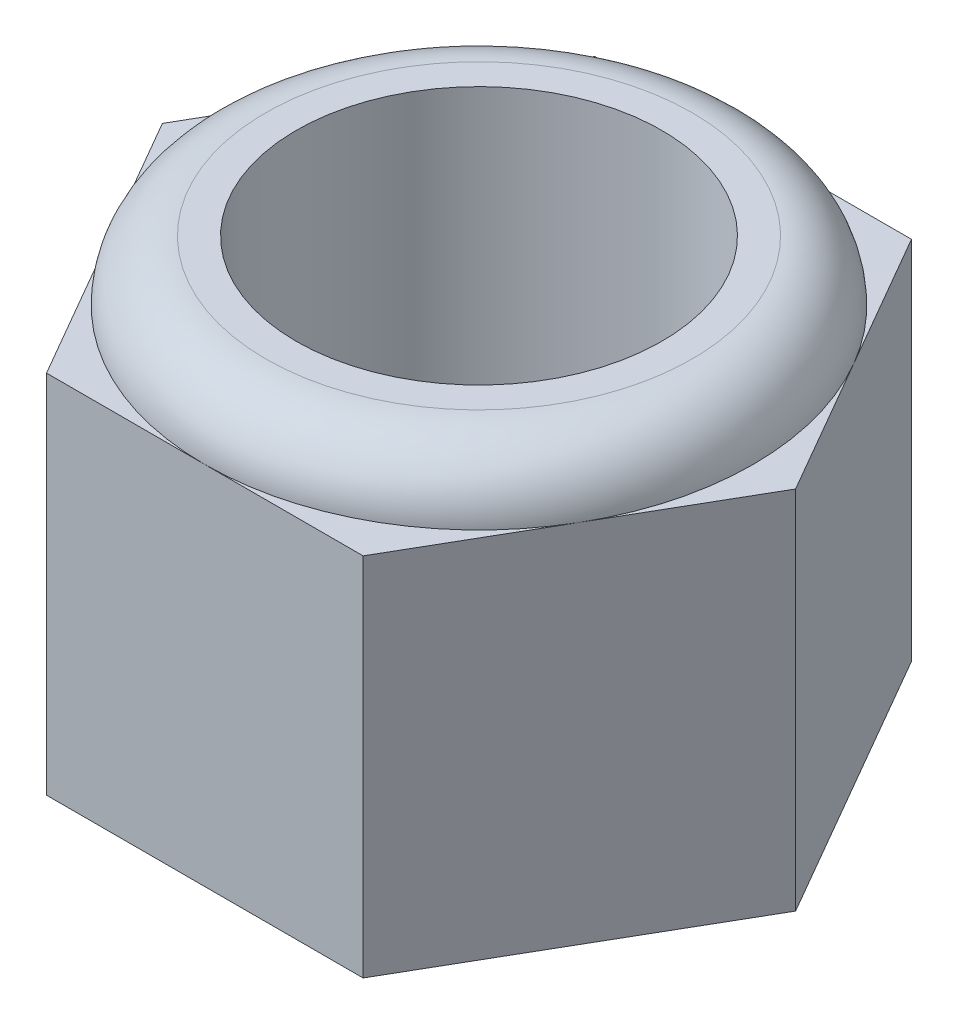
ISO-10303-21;
HEADER;
FILE_DESCRIPTION(('STEP AP214'),'2;1');
FILE_NAME('part.step','',(''),(''),'','','');
FILE_SCHEMA(('AUTOMOTIVE_DESIGN { 1 0 10303 214 1 1 1 1 }'));
ENDSEC;
DATA;
#1=APPLICATION_CONTEXT('core data for automotive mechanical design processes');
#2=APPLICATION_PROTOCOL_DEFINITION('international standard','automotive_design',2000,#1);
#3=PRODUCT_CONTEXT('',#1,'mechanical');
#4=PRODUCT('Part','Part','',(#3));
#5=PRODUCT_RELATED_PRODUCT_CATEGORY('part','',(#4));
#6=PRODUCT_DEFINITION_FORMATION('','',#4);
#7=PRODUCT_DEFINITION_CONTEXT('part definition',#1,'design');
#8=PRODUCT_DEFINITION('design','',#6,#7);
#9=PRODUCT_DEFINITION_SHAPE('','',#8);
#10=(LENGTH_UNIT() NAMED_UNIT(*) SI_UNIT(.MILLI.,.METRE.));
#11=(NAMED_UNIT(*) PLANE_ANGLE_UNIT() SI_UNIT($,.RADIAN.));
#12=(NAMED_UNIT(*) SI_UNIT($,.STERADIAN.) SOLID_ANGLE_UNIT());
#13=UNCERTAINTY_MEASURE_WITH_UNIT(LENGTH_MEASURE(1.E-05),#10,'distance_accuracy_value','');
#14=(GEOMETRIC_REPRESENTATION_CONTEXT(3) GLOBAL_UNCERTAINTY_ASSIGNED_CONTEXT((#13)) GLOBAL_UNIT_ASSIGNED_CONTEXT((#10,
#11,#12)) REPRESENTATION_CONTEXT('',''));
#15=CARTESIAN_POINT('',(0.,0.,0.));
#16=DIRECTION('',(0.,0.,1.));
#17=DIRECTION('',(1.,0.,0.));
#18=AXIS2_PLACEMENT_3D('',#15,#16,#17);
#19=CARTESIAN_POINT('',(16.4977839420936,22.225,0.));
#20=DIRECTION('',(-0.866025403784438,0.,0.5));
#21=DIRECTION('',(0.5,0.,0.866025403784439));
#22=AXIS2_PLACEMENT_3D('',#19,#20,#21);
#23=PLANE('',#22);
#24=DIRECTION('',(-0.5,0.,-0.866025403784439));
#25=VECTOR('',#24,1.);
#26=CARTESIAN_POINT('',(16.4977839420936,19.05,0.));
#27=LINE('',#26,#25);
#28=CARTESIAN_POINT('',(16.4977839420936,19.05,0.));
#29=VERTEX_POINT('',#28);
#30=CARTESIAN_POINT('',(12.3733379565702,19.05,-7.14375000000001));
#31=VERTEX_POINT('',#30);
#32=EDGE_CURVE('E144',#29,#31,#27,.T.);
#33=ORIENTED_EDGE('',*,*,#32,.F.);
#34=DIRECTION('',(0.,-1.,0.));
#35=VECTOR('',#34,1.);
#36=CARTESIAN_POINT('',(16.4977839420936,22.225,0.));
#37=LINE('',#36,#35);
#38=CARTESIAN_POINT('',(16.4977839420936,0.,0.));
#39=VERTEX_POINT('',#38);
#40=EDGE_CURVE('E60',#29,#39,#37,.T.);
#41=ORIENTED_EDGE('',*,*,#40,.T.);
#42=DIRECTION('',(-0.5,0.,-0.866025403784438));
#43=VECTOR('',#42,1.);
#44=CARTESIAN_POINT('',(16.4977839420936,0.,0.));
#45=LINE('',#44,#43);
#46=CARTESIAN_POINT('',(8.24889197104678,0.,-14.2875));
#47=VERTEX_POINT('',#46);
#48=EDGE_CURVE('E148',#39,#47,#45,.T.);
#49=ORIENTED_EDGE('',*,*,#48,.T.);
#50=DIRECTION('',(0.,-1.,0.));
#51=VECTOR('',#50,1.);
#52=CARTESIAN_POINT('',(8.24889197104678,22.225,-14.2875));
#53=LINE('',#52,#51);
#54=CARTESIAN_POINT('',(8.24889197104678,19.05,-14.2875));
#55=VERTEX_POINT('',#54);
#56=EDGE_CURVE('E173',#55,#47,#53,.T.);
#57=ORIENTED_EDGE('',*,*,#56,.F.);
#58=EDGE_CURVE('E116',#31,#55,#27,.T.);
#59=ORIENTED_EDGE('',*,*,#58,.F.);
#60=EDGE_LOOP('',(#33,#41,#49,#57,#59));
#61=FACE_BOUND('',#60,.T.);
#62=ADVANCED_FACE('F38',(#61),#23,.F.);
#63=CARTESIAN_POINT('',(8.24889197104678,22.225,-14.2875));
#64=DIRECTION('',(0.,0.,1.));
#65=DIRECTION('',(1.,0.,0.));
#66=AXIS2_PLACEMENT_3D('',#63,#64,#65);
#67=PLANE('',#66);
#68=DIRECTION('',(-1.,0.,0.));
#69=VECTOR('',#68,1.);
#70=CARTESIAN_POINT('',(8.24889197104678,19.05,-14.2875));
#71=LINE('',#70,#69);
#72=CARTESIAN_POINT('',(0.,19.05,-14.2875));
#73=VERTEX_POINT('',#72);
#74=EDGE_CURVE('E110',#55,#73,#71,.T.);
#75=ORIENTED_EDGE('',*,*,#74,.F.);
#76=ORIENTED_EDGE('',*,*,#56,.T.);
#77=DIRECTION('',(-1.,0.,0.));
#78=VECTOR('',#77,1.);
#79=CARTESIAN_POINT('',(8.24889197104678,0.,-14.2875));
#80=LINE('',#79,#78);
#81=CARTESIAN_POINT('',(-8.24889197104678,0.,-14.2875));
#82=VERTEX_POINT('',#81);
#83=EDGE_CURVE('E153',#47,#82,#80,.T.);
#84=ORIENTED_EDGE('',*,*,#83,.T.);
#85=DIRECTION('',(0.,-1.,0.));
#86=VECTOR('',#85,1.);
#87=CARTESIAN_POINT('',(-8.24889197104678,22.225,-14.2875));
#88=LINE('',#87,#86);
#89=CARTESIAN_POINT('',(-8.24889197104678,19.05,-14.2875));
#90=VERTEX_POINT('',#89);
#91=EDGE_CURVE('E138',#90,#82,#88,.T.);
#92=ORIENTED_EDGE('',*,*,#91,.F.);
#93=EDGE_CURVE('E120',#73,#90,#71,.T.);
#94=ORIENTED_EDGE('',*,*,#93,.F.);
#95=EDGE_LOOP('',(#75,#76,#84,#92,#94));
#96=FACE_BOUND('',#95,.T.);
#97=ADVANCED_FACE('F136',(#96),#67,.F.);
#98=CARTESIAN_POINT('',(-8.24889197104678,22.225,-14.2875));
#99=DIRECTION('',(0.866025403784439,0.,0.5));
#100=DIRECTION('',(0.5,0.,-0.866025403784439));
#101=AXIS2_PLACEMENT_3D('',#98,#99,#100);
#102=PLANE('',#101);
#103=DIRECTION('',(-0.5,0.,0.866025403784439));
#104=VECTOR('',#103,1.);
#105=CARTESIAN_POINT('',(-8.24889197104678,19.05,-14.2875));
#106=LINE('',#105,#104);
#107=CARTESIAN_POINT('',(-12.3733379565702,19.05,-7.14375));
#108=VERTEX_POINT('',#107);
#109=EDGE_CURVE('E127',#90,#108,#106,.T.);
#110=ORIENTED_EDGE('',*,*,#109,.F.);
#111=ORIENTED_EDGE('',*,*,#91,.T.);
#112=DIRECTION('',(-0.5,0.,0.866025403784439));
#113=VECTOR('',#112,1.);
#114=CARTESIAN_POINT('',(-8.24889197104678,0.,-14.2875));
#115=LINE('',#114,#113);
#116=CARTESIAN_POINT('',(-16.4977839420936,0.,0.));
#117=VERTEX_POINT('',#116);
#118=EDGE_CURVE('E155',#82,#117,#115,.T.);
#119=ORIENTED_EDGE('',*,*,#118,.T.);
#120=DIRECTION('',(0.,-1.,0.));
#121=VECTOR('',#120,1.);
#122=CARTESIAN_POINT('',(-16.4977839420936,22.225,0.));
#123=LINE('',#122,#121);
#124=CARTESIAN_POINT('',(-16.4977839420936,19.05,0.));
#125=VERTEX_POINT('',#124);
#126=EDGE_CURVE('E171',#125,#117,#123,.T.);
#127=ORIENTED_EDGE('',*,*,#126,.F.);
#128=EDGE_CURVE('E139',#108,#125,#106,.T.);
#129=ORIENTED_EDGE('',*,*,#128,.F.);
#130=EDGE_LOOP('',(#110,#111,#119,#127,#129));
#131=FACE_BOUND('',#130,.T.);
#132=ADVANCED_FACE('F190',(#131),#102,.F.);
#133=CARTESIAN_POINT('',(-16.4977839420936,22.225,0.));
#134=DIRECTION('',(0.866025403784438,0.,-0.5));
#135=DIRECTION('',(-0.5,0.,-0.866025403784438));
#136=AXIS2_PLACEMENT_3D('',#133,#134,#135);
#137=PLANE('',#136);
#138=DIRECTION('',(0.5,0.,0.866025403784438));
#139=VECTOR('',#138,1.);
#140=CARTESIAN_POINT('',(-16.4977839420936,19.05,0.));
#141=LINE('',#140,#139);
#142=CARTESIAN_POINT('',(-12.3733379565702,19.05,7.14375));
#143=VERTEX_POINT('',#142);
#144=EDGE_CURVE('E194',#125,#143,#141,.T.);
#145=ORIENTED_EDGE('',*,*,#144,.F.);
#146=ORIENTED_EDGE('',*,*,#126,.T.);
#147=DIRECTION('',(0.5,0.,0.866025403784438));
#148=VECTOR('',#147,1.);
#149=CARTESIAN_POINT('',(-16.4977839420936,0.,0.));
#150=LINE('',#149,#148);
#151=CARTESIAN_POINT('',(-8.24889197104677,0.,14.2875));
#152=VERTEX_POINT('',#151);
#153=EDGE_CURVE('E158',#117,#152,#150,.T.);
#154=ORIENTED_EDGE('',*,*,#153,.T.);
#155=DIRECTION('',(0.,-1.,0.));
#156=VECTOR('',#155,1.);
#157=CARTESIAN_POINT('',(-8.24889197104677,22.225,14.2875));
#158=LINE('',#157,#156);
#159=CARTESIAN_POINT('',(-8.24889197104677,19.05,14.2875));
#160=VERTEX_POINT('',#159);
#161=EDGE_CURVE('E169',#160,#152,#158,.T.);
#162=ORIENTED_EDGE('',*,*,#161,.F.);
#163=EDGE_CURVE('E195',#143,#160,#141,.T.);
#164=ORIENTED_EDGE('',*,*,#163,.F.);
#165=EDGE_LOOP('',(#145,#146,#154,#162,#164));
#166=FACE_BOUND('',#165,.T.);
#167=ADVANCED_FACE('F226',(#166),#137,.F.);
#168=CARTESIAN_POINT('',(-8.24889197104677,22.225,14.2875));
#169=DIRECTION('',(0.,0.,-1.));
#170=DIRECTION('',(-1.,0.,0.));
#171=AXIS2_PLACEMENT_3D('',#168,#169,#170);
#172=PLANE('',#171);
#173=DIRECTION('',(1.,0.,0.));
#174=VECTOR('',#173,1.);
#175=CARTESIAN_POINT('',(-8.24889197104677,19.05,14.2875));
#176=LINE('',#175,#174);
#177=CARTESIAN_POINT('',(0.,19.05,14.2875));
#178=VERTEX_POINT('',#177);
#179=EDGE_CURVE('E196',#160,#178,#176,.T.);
#180=ORIENTED_EDGE('',*,*,#179,.F.);
#181=ORIENTED_EDGE('',*,*,#161,.T.);
#182=DIRECTION('',(1.,0.,0.));
#183=VECTOR('',#182,1.);
#184=CARTESIAN_POINT('',(-8.24889197104677,0.,14.2875));
#185=LINE('',#184,#183);
#186=CARTESIAN_POINT('',(8.24889197104678,0.,14.2875));
#187=VERTEX_POINT('',#186);
#188=EDGE_CURVE('E161',#152,#187,#185,.T.);
#189=ORIENTED_EDGE('',*,*,#188,.T.);
#190=DIRECTION('',(0.,-1.,0.));
#191=VECTOR('',#190,1.);
#192=CARTESIAN_POINT('',(8.24889197104678,22.225,14.2875));
#193=LINE('',#192,#191);
#194=CARTESIAN_POINT('',(8.24889197104678,19.05,14.2875));
#195=VERTEX_POINT('',#194);
#196=EDGE_CURVE('E167',#195,#187,#193,.T.);
#197=ORIENTED_EDGE('',*,*,#196,.F.);
#198=EDGE_CURVE('E198',#178,#195,#176,.T.);
#199=ORIENTED_EDGE('',*,*,#198,.F.);
#200=EDGE_LOOP('',(#180,#181,#189,#197,#199));
#201=FACE_BOUND('',#200,.T.);
#202=ADVANCED_FACE('F215',(#201),#172,.F.);
#203=CARTESIAN_POINT('',(8.24889197104678,22.225,14.2875));
#204=DIRECTION('',(-0.866025403784438,0.,-0.5));
#205=DIRECTION('',(-0.5,0.,0.866025403784439));
#206=AXIS2_PLACEMENT_3D('',#203,#204,#205);
#207=PLANE('',#206);
#208=DIRECTION('',(0.5,0.,-0.866025403784439));
#209=VECTOR('',#208,1.);
#210=CARTESIAN_POINT('',(8.24889197104678,19.05,14.2875));
#211=LINE('',#210,#209);
#212=CARTESIAN_POINT('',(12.3733379565702,19.05,7.14375000000001));
#213=VERTEX_POINT('',#212);
#214=EDGE_CURVE('E11',#195,#213,#211,.T.);
#215=ORIENTED_EDGE('',*,*,#214,.F.);
#216=ORIENTED_EDGE('',*,*,#196,.T.);
#217=DIRECTION('',(0.5,0.,-0.866025403784439));
#218=VECTOR('',#217,1.);
#219=CARTESIAN_POINT('',(8.24889197104678,0.,14.2875));
#220=LINE('',#219,#218);
#221=EDGE_CURVE('E164',#187,#39,#220,.T.);
#222=ORIENTED_EDGE('',*,*,#221,.T.);
#223=ORIENTED_EDGE('',*,*,#40,.F.);
#224=EDGE_CURVE('E41',#213,#29,#211,.T.);
#225=ORIENTED_EDGE('',*,*,#224,.F.);
#226=EDGE_LOOP('',(#215,#216,#222,#223,#225));
#227=FACE_BOUND('',#226,.T.);
#228=ADVANCED_FACE('F179',(#227),#207,.F.);
#229=CARTESIAN_POINT('',(0.,22.225,0.));
#230=DIRECTION('',(0.,1.,0.));
#231=DIRECTION('',(0.,0.,1.));
#232=AXIS2_PLACEMENT_3D('',#229,#230,#231);
#233=PLANE('',#232);
#234=CARTESIAN_POINT('',(0.,22.225,0.));
#235=DIRECTION('',(0.,1.,0.));
#236=DIRECTION('',(0.,0.,1.));
#237=AXIS2_PLACEMENT_3D('',#234,#235,#236);
#238=CIRCLE('',#237,9.525);
#239=CARTESIAN_POINT('',(0.,22.225,9.525));
#240=VERTEX_POINT('',#239);
#241=EDGE_CURVE('E149',#240,#240,#238,.T.);
#242=ORIENTED_EDGE('',*,*,#241,.F.);
#243=EDGE_LOOP('',(#242));
#244=FACE_BOUND('',#243,.T.);
#245=CARTESIAN_POINT('',(0.,22.225,0.));
#246=DIRECTION('',(0.,-1.,0.));
#247=DIRECTION('',(0.,0.,-1.));
#248=AXIS2_PLACEMENT_3D('',#245,#246,#247);
#249=CIRCLE('',#248,11.1125);
#250=CARTESIAN_POINT('',(0.,22.225,-11.1125));
#251=VERTEX_POINT('',#250);
#252=EDGE_CURVE('E134',#251,#251,#249,.T.);
#253=ORIENTED_EDGE('',*,*,#252,.F.);
#254=EDGE_LOOP('',(#253));
#255=FACE_BOUND('',#254,.T.);
#256=ADVANCED_FACE('F204',(#244,#255),#233,.T.);
#257=CARTESIAN_POINT('',(0.,0.,0.));
#258=DIRECTION('',(0.,1.,0.));
#259=DIRECTION('',(0.,0.,1.));
#260=AXIS2_PLACEMENT_3D('',#257,#258,#259);
#261=PLANE('',#260);
#262=CARTESIAN_POINT('',(0.,0.,0.));
#263=DIRECTION('',(0.,1.,0.));
#264=DIRECTION('',(0.,0.,1.));
#265=AXIS2_PLACEMENT_3D('',#262,#263,#264);
#266=CIRCLE('',#265,9.525);
#267=CARTESIAN_POINT('',(0.,0.,9.525));
#268=VERTEX_POINT('',#267);
#269=EDGE_CURVE('E145',#268,#268,#266,.T.);
#270=ORIENTED_EDGE('',*,*,#269,.T.);
#271=EDGE_LOOP('',(#270));
#272=FACE_BOUND('',#271,.T.);
#273=ORIENTED_EDGE('',*,*,#48,.F.);
#274=ORIENTED_EDGE('',*,*,#221,.F.);
#275=ORIENTED_EDGE('',*,*,#188,.F.);
#276=ORIENTED_EDGE('',*,*,#153,.F.);
#277=ORIENTED_EDGE('',*,*,#118,.F.);
#278=ORIENTED_EDGE('',*,*,#83,.F.);
#279=EDGE_LOOP('',(#273,#274,#275,#276,#277,#278));
#280=FACE_BOUND('',#279,.T.);
#281=ADVANCED_FACE('F185',(#272,#280),#261,.F.);
#282=CARTESIAN_POINT('',(0.,0.,0.));
#283=DIRECTION('',(0.,1.,0.));
#284=DIRECTION('',(0.,0.,1.));
#285=AXIS2_PLACEMENT_3D('',#282,#283,#284);
#286=CYLINDRICAL_SURFACE('',#285,9.525);
#287=ORIENTED_EDGE('',*,*,#269,.F.);
#288=EDGE_LOOP('',(#287));
#289=FACE_BOUND('',#288,.T.);
#290=ORIENTED_EDGE('',*,*,#241,.T.);
#291=EDGE_LOOP('',(#290));
#292=FACE_BOUND('',#291,.T.);
#293=ADVANCED_FACE('F212',(#289,#292),#286,.F.);
#294=CARTESIAN_POINT('',(0.,19.05,14.2875));
#295=DIRECTION('',(0.,1.,0.));
#296=DIRECTION('',(0.,0.,1.));
#297=AXIS2_PLACEMENT_3D('',#294,#295,#296);
#298=PLANE('',#297);
#299=ORIENTED_EDGE('',*,*,#32,.T.);
#300=CARTESIAN_POINT('',(0.,19.05,0.));
#301=DIRECTION('',(0.,-1.,0.));
#302=DIRECTION('',(0.,0.,-1.));
#303=AXIS2_PLACEMENT_3D('',#300,#301,#302);
#304=CIRCLE('',#303,14.2875);
#305=EDGE_CURVE('E52',#31,#213,#304,.T.);
#306=ORIENTED_EDGE('',*,*,#305,.T.);
#307=ORIENTED_EDGE('',*,*,#224,.T.);
#308=EDGE_LOOP('',(#299,#306,#307));
#309=FACE_BOUND('',#308,.T.);
#310=ADVANCED_FACE('F176',(#309),#298,.T.);
#311=ORIENTED_EDGE('',*,*,#58,.T.);
#312=ORIENTED_EDGE('',*,*,#74,.T.);
#313=EDGE_CURVE('E114',#73,#31,#304,.T.);
#314=ORIENTED_EDGE('',*,*,#313,.T.);
#315=EDGE_LOOP('',(#311,#312,#314));
#316=FACE_BOUND('',#315,.T.);
#317=ADVANCED_FACE('F112',(#316),#298,.T.);
#318=ORIENTED_EDGE('',*,*,#93,.T.);
#319=ORIENTED_EDGE('',*,*,#109,.T.);
#320=EDGE_CURVE('E124',#108,#73,#304,.T.);
#321=ORIENTED_EDGE('',*,*,#320,.T.);
#322=EDGE_LOOP('',(#318,#319,#321));
#323=FACE_BOUND('',#322,.T.);
#324=ADVANCED_FACE('F125',(#323),#298,.T.);
#325=ORIENTED_EDGE('',*,*,#128,.T.);
#326=ORIENTED_EDGE('',*,*,#144,.T.);
#327=EDGE_CURVE('E131',#143,#108,#304,.T.);
#328=ORIENTED_EDGE('',*,*,#327,.T.);
#329=EDGE_LOOP('',(#325,#326,#328));
#330=FACE_BOUND('',#329,.T.);
#331=ADVANCED_FACE('F247',(#330),#298,.T.);
#332=ORIENTED_EDGE('',*,*,#163,.T.);
#333=ORIENTED_EDGE('',*,*,#179,.T.);
#334=EDGE_CURVE('E244',#178,#143,#304,.T.);
#335=ORIENTED_EDGE('',*,*,#334,.T.);
#336=EDGE_LOOP('',(#332,#333,#335));
#337=FACE_BOUND('',#336,.T.);
#338=ADVANCED_FACE('F243',(#337),#298,.T.);
#339=ORIENTED_EDGE('',*,*,#198,.T.);
#340=ORIENTED_EDGE('',*,*,#214,.T.);
#341=EDGE_CURVE('E246',#213,#178,#304,.T.);
#342=ORIENTED_EDGE('',*,*,#341,.T.);
#343=EDGE_LOOP('',(#339,#340,#342));
#344=FACE_BOUND('',#343,.T.);
#345=ADVANCED_FACE('F254',(#344),#298,.T.);
#346=CARTESIAN_POINT('',(0.,19.05,0.));
#347=DIRECTION('',(0.,-1.,0.));
#348=DIRECTION('',(0.,0.,-1.));
#349=AXIS2_PLACEMENT_3D('',#346,#347,#348);
#350=TOROIDAL_SURFACE('',#349,11.1125,3.175);
#351=ORIENTED_EDGE('',*,*,#252,.T.);
#352=EDGE_LOOP('',(#351));
#353=FACE_BOUND('',#352,.T.);
#354=ORIENTED_EDGE('',*,*,#313,.F.);
#355=ORIENTED_EDGE('',*,*,#320,.F.);
#356=ORIENTED_EDGE('',*,*,#327,.F.);
#357=ORIENTED_EDGE('',*,*,#334,.F.);
#358=ORIENTED_EDGE('',*,*,#341,.F.);
#359=ORIENTED_EDGE('',*,*,#305,.F.);
#360=EDGE_LOOP('',(#354,#355,#356,#357,#358,#359));
#361=FACE_BOUND('',#360,.T.);
#362=ADVANCED_FACE('F133',(#353,#361),#350,.T.);
#363=CLOSED_SHELL('',(#62,#97,#132,#167,#202,#228,#256,#281,#293,#310,#317,#324,#331,#338,#345,#362));
#364=MANIFOLD_SOLID_BREP('B2',#363);
#365=ADVANCED_BREP_SHAPE_REPRESENTATION('',(#18,#364),#14);
#366=SHAPE_DEFINITION_REPRESENTATION(#9,#365);
ENDSEC;
END-ISO-10303-21;
